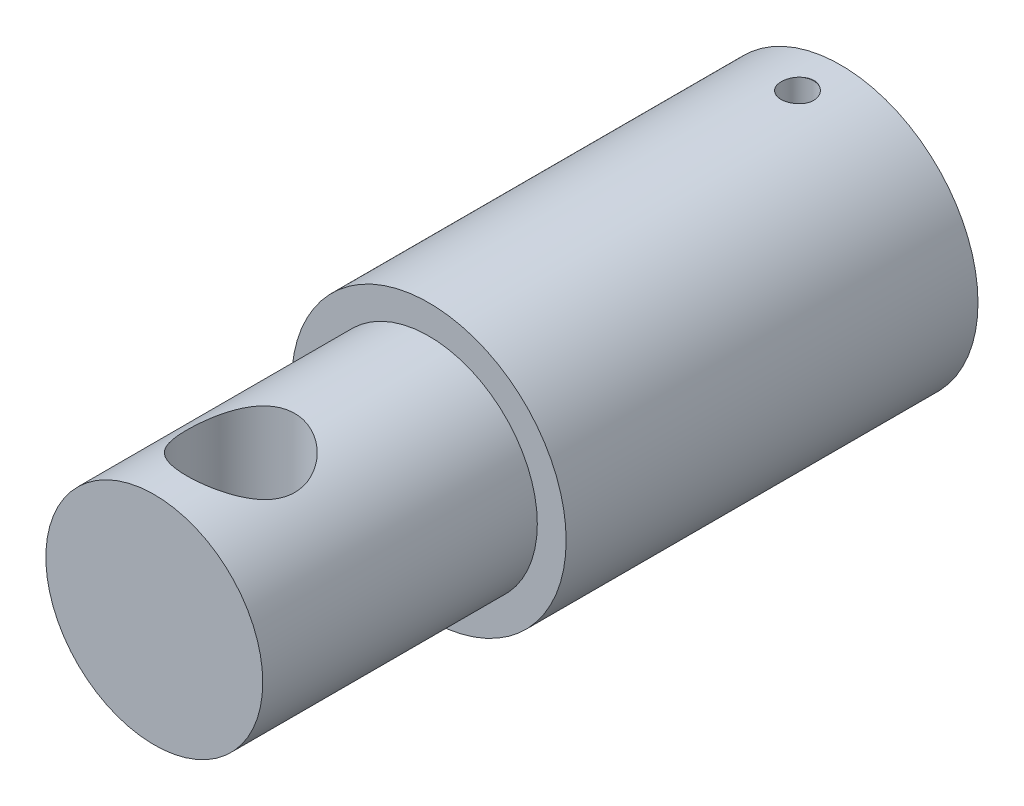
ISO-10303-21;
HEADER;
FILE_DESCRIPTION(('STEP AP214'),'2;1');
FILE_NAME('part.step','',(''),(''),'','','');
FILE_SCHEMA(('AUTOMOTIVE_DESIGN { 1 0 10303 214 1 1 1 1 }'));
ENDSEC;
DATA;
#1=APPLICATION_CONTEXT('core data for automotive mechanical design processes');
#2=APPLICATION_PROTOCOL_DEFINITION('international standard','automotive_design',2000,#1);
#3=PRODUCT_CONTEXT('',#1,'mechanical');
#4=PRODUCT('Part','Part','',(#3));
#5=PRODUCT_RELATED_PRODUCT_CATEGORY('part','',(#4));
#6=PRODUCT_DEFINITION_FORMATION('','',#4);
#7=PRODUCT_DEFINITION_CONTEXT('part definition',#1,'design');
#8=PRODUCT_DEFINITION('design','',#6,#7);
#9=PRODUCT_DEFINITION_SHAPE('','',#8);
#10=(LENGTH_UNIT() NAMED_UNIT(*) SI_UNIT(.MILLI.,.METRE.));
#11=(NAMED_UNIT(*) PLANE_ANGLE_UNIT() SI_UNIT($,.RADIAN.));
#12=(NAMED_UNIT(*) SI_UNIT($,.STERADIAN.) SOLID_ANGLE_UNIT());
#13=UNCERTAINTY_MEASURE_WITH_UNIT(LENGTH_MEASURE(1.E-05),#10,'distance_accuracy_value','');
#14=(GEOMETRIC_REPRESENTATION_CONTEXT(3) GLOBAL_UNCERTAINTY_ASSIGNED_CONTEXT((#13)) GLOBAL_UNIT_ASSIGNED_CONTEXT((#10,
#11,#12)) REPRESENTATION_CONTEXT('',''));
#15=CARTESIAN_POINT('',(0.,0.,0.));
#16=DIRECTION('',(0.,0.,1.));
#17=DIRECTION('',(1.,0.,0.));
#18=AXIS2_PLACEMENT_3D('',#15,#16,#17);
#19=CARTESIAN_POINT('',(0.,0.,38.1));
#20=DIRECTION('',(0.,0.,-1.));
#21=DIRECTION('',(-1.,0.,0.));
#22=AXIS2_PLACEMENT_3D('',#19,#20,#21);
#23=CYLINDRICAL_SURFACE('',#22,12.7);
#24=CARTESIAN_POINT('',(0.796476616103138,12.675,2.72892761811106));
#25=CARTESIAN_POINT('',(0.83228326903176,12.6727504600005,2.75136520389631));
#26=CARTESIAN_POINT('',(0.867120049985733,12.6704084743594,2.77530248675138));
#27=CARTESIAN_POINT('',(0.934645159015516,12.6656062503982,2.82602243491229));
#28=CARTESIAN_POINT('',(0.96733360011083,12.6631460183107,2.85280495034235));
#29=CARTESIAN_POINT('',(1.06178077488259,12.6556944774986,2.93711447745145));
#30=CARTESIAN_POINT('',(1.12002264056247,12.6506256612281,2.99866708112203));
#31=CARTESIAN_POINT('',(1.22534261391677,12.6408602942846,3.13070151915007));
#32=CARTESIAN_POINT('',(1.2724155167279,12.6361639178487,3.20118749317832));
#33=CARTESIAN_POINT('',(1.35405442168214,12.6276769552268,3.34910368580835));
#34=CARTESIAN_POINT('',(1.38862383717649,12.6238861219309,3.42653200199308));
#35=CARTESIAN_POINT('',(1.44419509437218,12.6176498233528,3.58597778134985));
#36=CARTESIAN_POINT('',(1.46522576315119,12.6152015012181,3.66798508720136));
#37=CARTESIAN_POINT('',(1.49321899540092,12.6119189174168,3.83441606786694));
#38=CARTESIAN_POINT('',(1.50017909478827,12.6110849384602,3.91884016329209));
#39=CARTESIAN_POINT('',(1.49981500112052,12.6111281966319,4.08713402059207));
#40=CARTESIAN_POINT('',(1.49257866963736,12.61199490821,4.17100398903161));
#41=CARTESIAN_POINT('',(1.46421589421185,12.6153189779794,4.33630844653025));
#42=CARTESIAN_POINT('',(1.44309242239105,12.6177759958122,4.41774345282118));
#43=CARTESIAN_POINT('',(1.38758019560208,12.624000735098,4.57588249832213));
#44=CARTESIAN_POINT('',(1.3531948152323,12.6277681230929,4.65258773530518));
#45=CARTESIAN_POINT('',(1.2721442449831,12.6361902923363,4.79916803692011));
#46=CARTESIAN_POINT('',(1.22547557817368,12.6408453247401,4.86904115994833));
#47=CARTESIAN_POINT('',(1.12059361607007,12.6505753414022,5.00070744635629));
#48=CARTESIAN_POINT('',(1.06226804111814,12.6556541058223,5.06241148065851));
#49=CARTESIAN_POINT('',(0.967662878393486,12.6631209977478,5.14692055840801));
#50=CARTESIAN_POINT('',(0.93491474545614,12.665586525613,5.17376601245782));
#51=CARTESIAN_POINT('',(0.867261318548442,12.6703989779319,5.22460039702882));
#52=CARTESIAN_POINT('',(0.832355929660025,12.6727458971586,5.2485892017229));
#53=CARTESIAN_POINT('',(0.79647661610314,12.675,5.271072381889));
#54=B_SPLINE_CURVE_WITH_KNOTS('',3,(#24,#25,#26,#27,#28,#29,#30,#31,#32,#33,#34,#35,#36,#37,#38,
#39,#40,#41,#42,#43,#44,#45,#46,#47,#48,#49,#50,#51,#52,#53),.UNSPECIFIED.,.F.,.F.,(4,2,2,2,2,2,
2,2,2,2,2,2,2,2,4),(0.,0.126868740513763,0.253730801386699,0.507100136603615,0.76058731391335,
1.01400523894437,1.26688177901155,1.51980259979673,1.77116303359225,2.02246968880958,
2.27371243918891,2.52502638343692,2.77888902049528,2.90600911171719,3.03313480014016),.UNSPECIFIED.);
#55=CARTESIAN_POINT('',(0.796476616103138,12.675,2.72892761811106));
#56=VERTEX_POINT('',#55);
#57=CARTESIAN_POINT('',(0.796476616103138,12.675,5.271072381889));
#58=VERTEX_POINT('',#57);
#59=EDGE_CURVE('E67',#56,#58,#54,.T.);
#60=ORIENTED_EDGE('',*,*,#59,.T.);
#61=CARTESIAN_POINT('',(0.838339257102967,12.6723,5.24060250684904));
#62=CARTESIAN_POINT('',(0.779235874734315,12.6762227277297,5.28533335361582));
#63=CARTESIAN_POINT('',(0.71660566360087,12.6799389014039,5.32545955951411));
#64=CARTESIAN_POINT('',(0.585728130001287,12.6866518515528,5.39552305013213));
#65=CARTESIAN_POINT('',(0.51747220460824,12.6896474977152,5.42544435646564));
#66=CARTESIAN_POINT('',(0.371858119090404,12.6947792090597,5.47573938066303));
#67=CARTESIAN_POINT('',(0.294199077883257,12.6968367953454,5.49525918816023));
#68=CARTESIAN_POINT('',(0.136723322408732,12.6995075462745,5.52045295750477));
#69=CARTESIAN_POINT('',(0.0569090205334546,12.7001222632439,5.5261417997757));
#70=CARTESIAN_POINT('',(-0.0994117426896097,12.6998423506763,5.52352815223721));
#71=CARTESIAN_POINT('',(-0.175927691053508,12.699004692173,5.51575378611459));
#72=CARTESIAN_POINT('',(-0.326619288710709,12.6960232965198,5.48751809439153));
#73=CARTESIAN_POINT('',(-0.400793071953805,12.6938785442869,5.46704690828037));
#74=CARTESIAN_POINT('',(-0.538254247920023,12.6887578886898,5.41654826333883));
#75=CARTESIAN_POINT('',(-0.601922453606824,12.685873229846,5.38753655007323));
#76=CARTESIAN_POINT('',(-0.724200970540768,12.679484967344,5.32055902608218));
#77=CARTESIAN_POINT('',(-0.782819100470136,12.6759823470289,5.28260740946126));
#78=CARTESIAN_POINT('',(-0.838339257102968,12.6723,5.24060250684904));
#79=B_SPLINE_CURVE_WITH_KNOTS('',3,(#61,#62,#63,#64,#65,#66,#67,#68,#69,#70,#71,#72,#73,#74,#75,
#76,#77,#78),.UNSPECIFIED.,.F.,.F.,(4,2,2,2,2,2,2,2,4),(0.,0.222490547030078,0.44532787770079,
0.684392057655266,0.923198919807684,1.15284889870033,1.38267745037067,1.59199756678331,
1.80098755430021),.UNSPECIFIED.);
#80=CARTESIAN_POINT('',(-0.796476616103138,12.675,5.271072381889));
#81=VERTEX_POINT('',#80);
#82=EDGE_CURVE('E11',#58,#81,#79,.T.);
#83=ORIENTED_EDGE('',*,*,#82,.T.);
#84=CARTESIAN_POINT('',(-0.796476616103138,12.675,5.271072381889));
#85=CARTESIAN_POINT('',(-0.83228326903176,12.6727504600005,5.24863479610375));
#86=CARTESIAN_POINT('',(-0.867120049985733,12.6704084743594,5.22469751324868));
#87=CARTESIAN_POINT('',(-0.934645159015516,12.6656062503982,5.17397756508777));
#88=CARTESIAN_POINT('',(-0.967333600110831,12.6631460183107,5.14719504965771));
#89=CARTESIAN_POINT('',(-1.06178077488259,12.6556944774986,5.06288552254861));
#90=CARTESIAN_POINT('',(-1.12002264056247,12.6506256612281,5.00133291887804));
#91=CARTESIAN_POINT('',(-1.22534261391677,12.6408602942846,4.86929848084999));
#92=CARTESIAN_POINT('',(-1.2724155167279,12.6361639178487,4.79881250682174));
#93=CARTESIAN_POINT('',(-1.35405442168214,12.6276769552268,4.65089631419171));
#94=CARTESIAN_POINT('',(-1.38862383717649,12.6238861219309,4.57346799800698));
#95=CARTESIAN_POINT('',(-1.44419509437218,12.6176498233528,4.41402221865022));
#96=CARTESIAN_POINT('',(-1.46522576315119,12.6152015012181,4.3320149127987));
#97=CARTESIAN_POINT('',(-1.49321899540092,12.6119189174168,4.16558393213312));
#98=CARTESIAN_POINT('',(-1.50017909478827,12.6110849384602,4.08115983670797));
#99=CARTESIAN_POINT('',(-1.49981500112052,12.6111281966319,3.91286597940799));
#100=CARTESIAN_POINT('',(-1.49257866963736,12.61199490821,3.82899601096845));
#101=CARTESIAN_POINT('',(-1.46421589421185,12.6153189779794,3.66369155346981));
#102=CARTESIAN_POINT('',(-1.44309242239105,12.6177759958122,3.58225654717888));
#103=CARTESIAN_POINT('',(-1.38758019560208,12.624000735098,3.42411750167793));
#104=CARTESIAN_POINT('',(-1.3531948152323,12.6277681230929,3.34741226469488));
#105=CARTESIAN_POINT('',(-1.2721442449831,12.6361902923363,3.20083196307995));
#106=CARTESIAN_POINT('',(-1.22547557817368,12.6408453247401,3.13095884005173));
#107=CARTESIAN_POINT('',(-1.12059361607007,12.6505753414022,2.99929255364377));
#108=CARTESIAN_POINT('',(-1.06226804111814,12.6556541058223,2.93758851934155));
#109=CARTESIAN_POINT('',(-0.967662878393486,12.6631209977478,2.85307944159205));
#110=CARTESIAN_POINT('',(-0.93491474545614,12.665586525613,2.82623398754224));
#111=CARTESIAN_POINT('',(-0.867261318548442,12.6703989779319,2.77539960297124));
#112=CARTESIAN_POINT('',(-0.832355929660025,12.6727458971586,2.75141079827715));
#113=CARTESIAN_POINT('',(-0.79647661610314,12.675,2.72892761811106));
#114=B_SPLINE_CURVE_WITH_KNOTS('',3,(#84,#85,#86,#87,#88,#89,#90,#91,#92,#93,#94,#95,#96,#97,
#98,#99,#100,#101,#102,#103,#104,#105,#106,#107,#108,#109,#110,#111,#112,#113),.UNSPECIFIED.,
.F.,.F.,(4,2,2,2,2,2,2,2,2,2,2,2,2,2,4),(0.,0.126868740513764,0.253730801386699,
0.507100136603615,0.76058731391335,1.01400523894437,1.26688177901155,1.51980259979674,
1.77116303359225,2.02246968880959,2.27371243918891,2.52502638343693,2.77888902049528,
2.90600911171719,3.03313480014017),.UNSPECIFIED.);
#115=CARTESIAN_POINT('',(-0.796476616103138,12.675,2.72892761811106));
#116=VERTEX_POINT('',#115);
#117=EDGE_CURVE('E60',#81,#116,#114,.T.);
#118=ORIENTED_EDGE('',*,*,#117,.T.);
#119=CARTESIAN_POINT('',(-0.83833925710296,12.6723,2.75939749315101));
#120=CARTESIAN_POINT('',(-0.779235874734307,12.6762227277297,2.71466664638423));
#121=CARTESIAN_POINT('',(-0.716605663600862,12.6799389014039,2.67454044048595));
#122=CARTESIAN_POINT('',(-0.585728130001278,12.6866518515528,2.60447694986792));
#123=CARTESIAN_POINT('',(-0.517472204608232,12.6896474977152,2.57455564353441));
#124=CARTESIAN_POINT('',(-0.371858119090395,12.6947792090597,2.52426061933703));
#125=CARTESIAN_POINT('',(-0.294199077883248,12.6968367953454,2.50474081183983));
#126=CARTESIAN_POINT('',(-0.136723322408723,12.6995075462745,2.47954704249529));
#127=CARTESIAN_POINT('',(-0.0569090205334451,12.7001222632439,2.47385820022436));
#128=CARTESIAN_POINT('',(0.0994117426896195,12.6998423506763,2.47647184776285));
#129=CARTESIAN_POINT('',(0.175927691053518,12.699004692173,2.48424621388547));
#130=CARTESIAN_POINT('',(0.326619288710719,12.6960232965198,2.51248190560853));
#131=CARTESIAN_POINT('',(0.400793071953815,12.6938785442869,2.53295309171969));
#132=CARTESIAN_POINT('',(0.538254247920029,12.6887578886898,2.58345173666123));
#133=CARTESIAN_POINT('',(0.601922453606827,12.685873229846,2.61246344992683));
#134=CARTESIAN_POINT('',(0.724200970540765,12.679484967344,2.67944097391787));
#135=CARTESIAN_POINT('',(0.78281910047013,12.6759823470289,2.71739259053879));
#136=CARTESIAN_POINT('',(0.83833925710296,12.6723,2.75939749315101));
#137=B_SPLINE_CURVE_WITH_KNOTS('',3,(#119,#120,#121,#122,#123,#124,#125,#126,#127,#128,#129,
#130,#131,#132,#133,#134,#135,#136),.UNSPECIFIED.,.F.,.F.,(4,2,2,2,2,2,2,2,4),(0.,
0.222490547030077,0.445327877700791,0.684392057655266,0.923198919807686,1.15284889870033,
1.38267745037067,1.5919975667833,1.80098755430019),.UNSPECIFIED.);
#138=EDGE_CURVE('E49',#116,#56,#137,.T.);
#139=ORIENTED_EDGE('',*,*,#138,.T.);
#140=EDGE_LOOP('',(#60,#83,#118,#139));
#141=FACE_BOUND('',#140,.T.);
#142=CARTESIAN_POINT('',(0.,0.,38.1));
#143=DIRECTION('',(0.,0.,1.));
#144=DIRECTION('',(1.,0.,0.));
#145=AXIS2_PLACEMENT_3D('',#142,#143,#144);
#146=CIRCLE('',#145,12.7);
#147=CARTESIAN_POINT('',(12.7,0.,38.1));
#148=VERTEX_POINT('',#147);
#149=EDGE_CURVE('E82',#148,#148,#146,.T.);
#150=ORIENTED_EDGE('',*,*,#149,.F.);
#151=EDGE_LOOP('',(#150));
#152=FACE_BOUND('',#151,.T.);
#153=CARTESIAN_POINT('',(0.,0.,0.));
#154=DIRECTION('',(0.,0.,1.));
#155=DIRECTION('',(1.,0.,0.));
#156=AXIS2_PLACEMENT_3D('',#153,#154,#155);
#157=CIRCLE('',#156,12.7);
#158=CARTESIAN_POINT('',(12.7,0.,0.));
#159=VERTEX_POINT('',#158);
#160=EDGE_CURVE('E89',#159,#159,#157,.T.);
#161=ORIENTED_EDGE('',*,*,#160,.T.);
#162=EDGE_LOOP('',(#161));
#163=FACE_BOUND('',#162,.T.);
#164=ADVANCED_FACE('F36',(#141,#152,#163),#23,.T.);
#165=CARTESIAN_POINT('',(0.,0.,38.1));
#166=DIRECTION('',(0.,0.,1.));
#167=DIRECTION('',(1.,0.,0.));
#168=AXIS2_PLACEMENT_3D('',#165,#166,#167);
#169=PLANE('',#168);
#170=CARTESIAN_POINT('',(0.,0.,38.1));
#171=DIRECTION('',(0.,0.,1.));
#172=DIRECTION('',(1.,0.,0.));
#173=AXIS2_PLACEMENT_3D('',#170,#171,#172);
#174=CIRCLE('',#173,10.033);
#175=CARTESIAN_POINT('',(10.033,0.,38.1));
#176=VERTEX_POINT('',#175);
#177=EDGE_CURVE('E80',#176,#176,#174,.T.);
#178=ORIENTED_EDGE('',*,*,#177,.F.);
#179=EDGE_LOOP('',(#178));
#180=FACE_BOUND('',#179,.T.);
#181=ORIENTED_EDGE('',*,*,#149,.T.);
#182=EDGE_LOOP('',(#181));
#183=FACE_BOUND('',#182,.T.);
#184=ADVANCED_FACE('F141',(#180,#183),#169,.T.);
#185=CARTESIAN_POINT('',(0.,0.,0.));
#186=DIRECTION('',(0.,0.,1.));
#187=DIRECTION('',(1.,0.,0.));
#188=AXIS2_PLACEMENT_3D('',#185,#186,#187);
#189=PLANE('',#188);
#190=CARTESIAN_POINT('',(0.,0.,0.));
#191=DIRECTION('',(0.,0.,-1.));
#192=DIRECTION('',(-1.,0.,0.));
#193=AXIS2_PLACEMENT_3D('',#190,#191,#192);
#194=CIRCLE('',#193,3.);
#195=CARTESIAN_POINT('',(-3.,0.,0.));
#196=VERTEX_POINT('',#195);
#197=EDGE_CURVE('E123',#196,#196,#194,.T.);
#198=ORIENTED_EDGE('',*,*,#197,.F.);
#199=EDGE_LOOP('',(#198));
#200=FACE_BOUND('',#199,.T.);
#201=ORIENTED_EDGE('',*,*,#160,.F.);
#202=EDGE_LOOP('',(#201));
#203=FACE_BOUND('',#202,.T.);
#204=ADVANCED_FACE('F138',(#200,#203),#189,.F.);
#205=CARTESIAN_POINT('',(0.,0.,63.5));
#206=DIRECTION('',(0.,0.,-1.));
#207=DIRECTION('',(-1.,0.,0.));
#208=AXIS2_PLACEMENT_3D('',#205,#206,#207);
#209=CYLINDRICAL_SURFACE('',#208,10.033);
#210=CARTESIAN_POINT('',(0.,10.033,60.5));
#211=CARTESIAN_POINT('',(-0.131540864730195,10.0329995722647,60.4999995330943));
#212=CARTESIAN_POINT('',(-0.263091696220209,10.0304070045411,60.4948030878062));
#213=CARTESIAN_POINT('',(-0.525225098454785,10.0201020323533,60.4740763194969));
#214=CARTESIAN_POINT('',(-0.655807218306546,10.0123873785436,60.45854145639));
#215=CARTESIAN_POINT('',(-0.915154955050193,9.99202298337232,60.4172915662735));
#216=CARTESIAN_POINT('',(-1.0439176769707,9.97936613259274,60.3915618730721));
#217=CARTESIAN_POINT('',(-1.29856322748691,9.9494356181176,60.3302066500944));
#218=CARTESIAN_POINT('',(-1.42444485592179,9.9321600671134,60.2945770747611));
#219=CARTESIAN_POINT('',(-1.67191505508108,9.89350288890859,60.213974637149));
#220=CARTESIAN_POINT('',(-1.79351986414459,9.87213937759451,60.169042928074));
#221=CARTESIAN_POINT('',(-2.03230766887236,9.825764056782,60.0701693599418));
#222=CARTESIAN_POINT('',(-2.14948898015281,9.8007508748499,60.0162241102918));
#223=CARTESIAN_POINT('',(-2.49329350202596,9.72109789530213,59.8415956220922));
#224=CARTESIAN_POINT('',(-2.71245118691574,9.66179996625116,59.7080294922662));
#225=CARTESIAN_POINT('',(-3.13885367064866,9.53212540783466,59.401377247378));
#226=CARTESIAN_POINT('',(-3.34458646361368,9.46129667565411,59.2263957025608));
#227=CARTESIAN_POINT('',(-3.72518869528113,9.31801734965284,58.8459645353375));
#228=CARTESIAN_POINT('',(-3.90003478107372,9.24556557491788,58.6404920734136));
#229=CARTESIAN_POINT('',(-4.22741994711618,9.10079694381141,58.1857317418323));
#230=CARTESIAN_POINT('',(-4.37720913768655,9.02891903097577,57.9342894248932));
#231=CARTESIAN_POINT('',(-4.56803395431131,8.93304159627392,57.5382870465914));
#232=CARTESIAN_POINT('',(-4.62601295296677,8.90306423299332,57.4030974804431));
#233=CARTESIAN_POINT('',(-4.73008911303649,8.84820924629343,57.1272501194843));
#234=CARTESIAN_POINT('',(-4.77619328891637,8.82332861401796,56.9865956095957));
#235=CARTESIAN_POINT('',(-4.85355758968325,8.780996446313,56.7093223887059));
#236=CARTESIAN_POINT('',(-4.88553443343517,8.76319253072689,56.5729570699114));
#237=CARTESIAN_POINT('',(-4.93798952530083,8.73374243064269,56.2974378204199));
#238=CARTESIAN_POINT('',(-4.9584738549028,8.72209298957503,56.1582854050238));
#239=CARTESIAN_POINT('',(-4.9876415560458,8.70544683191919,55.8784345368941));
#240=CARTESIAN_POINT('',(-4.99633192530836,8.70044617044018,55.7377370509041));
#241=CARTESIAN_POINT('',(-5.00179041304937,8.69730959634689,55.4560404198524));
#242=CARTESIAN_POINT('',(-4.99855965575494,8.69917303641045,55.3150413044892));
#243=CARTESIAN_POINT('',(-4.98132666139066,8.70904999094334,55.0508075907944));
#244=CARTESIAN_POINT('',(-4.96865156315122,8.71630549721633,54.9274551315232));
#245=CARTESIAN_POINT('',(-4.93424953685685,8.73582634418467,54.6823830774975));
#246=CARTESIAN_POINT('',(-4.91251976315517,8.74809325981063,54.5606640084987));
#247=CARTESIAN_POINT('',(-4.86025821990202,8.77723602366804,54.3197109079259));
#248=CARTESIAN_POINT('',(-4.82972756350737,8.79411128901013,54.2004765641218));
#249=CARTESIAN_POINT('',(-4.76018186740574,8.83194876720125,53.9651562890291));
#250=CARTESIAN_POINT('',(-4.7211634952337,8.85291258497108,53.8490716145621));
#251=CARTESIAN_POINT('',(-4.58991232170742,8.92209378712494,53.5012639636328));
#252=CARTESIAN_POINT('',(-4.48466729113753,8.97590525992497,53.2754116941641));
#253=CARTESIAN_POINT('',(-4.2432217843293,9.09252876847846,52.8436096732189));
#254=CARTESIAN_POINT('',(-4.10700741031805,9.15534484043653,52.6376689165317));
#255=CARTESIAN_POINT('',(-3.78749729922859,9.29246187022492,52.224110751675));
#256=CARTESIAN_POINT('',(-3.60043371007258,9.3672132870509,52.0195442923545));
#257=CARTESIAN_POINT('',(-3.19419244107262,9.5133961149528,51.6433544138119));
#258=CARTESIAN_POINT('',(-2.97499969147764,9.584825947261,51.4717465411123));
#259=CARTESIAN_POINT('',(-2.62028945090877,9.68562402899397,51.2390878656359));
#260=CARTESIAN_POINT('',(-2.49466097955547,9.71881796501704,51.164317218799));
#261=CARTESIAN_POINT('',(-2.23661541825869,9.7814225380882,51.0257438671112));
#262=CARTESIAN_POINT('',(-2.10420121904226,9.8108347677148,50.9619365414776));
#263=CARTESIAN_POINT('',(-1.83351172413531,9.86500759821179,50.8459789949352));
#264=CARTESIAN_POINT('',(-1.69523879407558,9.88977005503232,50.7938241213821));
#265=CARTESIAN_POINT('',(-1.41383468641849,9.93390311862201,50.7017736304453));
#266=CARTESIAN_POINT('',(-1.27070406562787,9.95327434102854,50.6618766132548));
#267=CARTESIAN_POINT('',(-0.992765288481646,9.98465950326604,50.5976482319078));
#268=CARTESIAN_POINT('',(-0.858244031533172,9.99714838838779,50.5723046501154));
#269=CARTESIAN_POINT('',(-0.587193765444006,10.0167234403292,50.5327112884579));
#270=CARTESIAN_POINT('',(-0.450664933287122,10.0238100805237,50.5184605365747));
#271=CARTESIAN_POINT('',(-0.176774275648409,10.0323778933791,50.5012428725512));
#272=CARTESIAN_POINT('',(-0.0394127859880248,10.0338611925189,50.498271679794));
#273=CARTESIAN_POINT('',(0.23503048067839,10.0311852743541,50.5036418173939));
#274=CARTESIAN_POINT('',(0.37211226964314,10.0270263035739,50.5119826535009));
#275=CARTESIAN_POINT('',(0.634310169970533,10.0137216816871,50.5387849557536));
#276=CARTESIAN_POINT('',(0.759533180244535,10.0049857070186,50.5564155655778));
#277=CARTESIAN_POINT('',(1.00794131318881,9.98302044461568,50.6010220689851));
#278=CARTESIAN_POINT('',(1.13112577700337,9.96978973282393,50.6280009244058));
#279=CARTESIAN_POINT('',(1.37458430164348,9.93914728078672,50.6910168419642));
#280=CARTESIAN_POINT('',(1.49485923954788,9.92173681826401,50.7270511360702));
#281=CARTESIAN_POINT('',(1.73183826220454,9.88313074649505,50.8078327394444));
#282=CARTESIAN_POINT('',(1.84854095935088,9.86193368769632,50.8525833860271));
#283=CARTESIAN_POINT('',(2.19878769267123,9.79203596530955,51.0021264201482));
#284=CARTESIAN_POINT('',(2.42565260708697,9.73791900500297,51.1204399814796));
#285=CARTESIAN_POINT('',(2.8569447254172,9.62024520509635,51.3887316990956));
#286=CARTESIAN_POINT('',(3.06136228701047,9.55668433621089,51.5387233825598));
#287=CARTESIAN_POINT('',(3.46327268095114,9.41892836756956,51.8830350124518));
#288=CARTESIAN_POINT('',(3.65813744288069,9.344301021795,52.0802542120161));
#289=CARTESIAN_POINT('',(4.0132435895597,9.1973890075663,52.50492599364));
#290=CARTESIAN_POINT('',(4.17346141186284,9.12510596162772,52.7323989817457));
#291=CARTESIAN_POINT('',(4.38793196713052,9.02296170305543,53.0984614596365));
#292=CARTESIAN_POINT('',(4.45634292210781,8.98927376161504,53.2278754215238));
#293=CARTESIAN_POINT('',(4.58186024359912,8.92594991942466,53.4930027574964));
#294=CARTESIAN_POINT('',(4.63897172918507,8.89631218567369,53.6287132444667));
#295=CARTESIAN_POINT('',(4.741219346787,8.8422438820863,53.9054513028168));
#296=CARTESIAN_POINT('',(4.78636519243357,8.81780909172168,54.0464744545213));
#297=CARTESIAN_POINT('',(4.86413033543301,8.77515234376633,54.3328508097709));
#298=CARTESIAN_POINT('',(4.89675155677885,8.75692943197482,54.4782033445503));
#299=CARTESIAN_POINT('',(4.9464554595233,8.72894030191192,54.7578582319066));
#300=CARTESIAN_POINT('',(4.96472705957398,8.71853132949257,54.8918857187632));
#301=CARTESIAN_POINT('',(4.99035023734126,8.70389077634884,55.161311232261));
#302=CARTESIAN_POINT('',(4.99770294306826,8.69965855751647,55.2967091158739));
#303=CARTESIAN_POINT('',(5.00137718008069,8.69754675514822,55.5676564770319));
#304=CARTESIAN_POINT('',(4.99770250866788,8.69966498482109,55.7032058863296));
#305=CARTESIAN_POINT('',(4.97938752293832,8.71016070385181,55.9733105592988));
#306=CARTESIAN_POINT('',(4.96474764653285,8.71853794324706,56.1078658624547));
#307=CARTESIAN_POINT('',(4.92660966989265,8.7401393291248,56.3622405612726));
#308=CARTESIAN_POINT('',(4.90407859130426,8.75283108464783,56.4822516398906));
#309=CARTESIAN_POINT('',(4.85045826430013,8.78265769470579,56.7197953041875));
#310=CARTESIAN_POINT('',(4.81936636650091,8.79979392461143,56.8373271104441));
#311=CARTESIAN_POINT('',(4.71369630667917,8.85712361598422,57.1851371558988));
#312=CARTESIAN_POINT('',(4.62669924843954,8.90325279528233,57.4107906414114));
#313=CARTESIAN_POINT('',(4.41561055864521,9.00989985556859,57.859678728259));
#314=CARTESIAN_POINT('',(4.28941862898353,9.07117647670349,58.081731240036));
#315=CARTESIAN_POINT('',(4.00581214149671,9.19993466752445,58.5029931465268));
#316=CARTESIAN_POINT('',(3.84838139936376,9.26741944379022,58.7021906156428));
#317=CARTESIAN_POINT('',(3.48458761178114,9.41070711263796,59.0969639551089));
#318=CARTESIAN_POINT('',(3.2746151021775,9.48653312397083,59.2892154560168));
#319=CARTESIAN_POINT('',(2.8230976193965,9.63053399844143,59.6365589165295));
#320=CARTESIAN_POINT('',(2.58153586601247,9.69870475908156,59.7916310014959));
#321=CARTESIAN_POINT('',(2.19914273910541,9.7899090785333,59.992748003288));
#322=CARTESIAN_POINT('',(2.06780120374332,9.81855569691538,60.0547124213021));
#323=CARTESIAN_POINT('',(1.79945764293371,9.87125550229536,60.1672347183668));
#324=CARTESIAN_POINT('',(1.66245843667665,9.89531094424818,60.2177981992093));
#325=CARTESIAN_POINT('',(1.38411447022361,9.93806369465875,60.3068221914098));
#326=CARTESIAN_POINT('',(1.24277997677353,9.95677272068872,60.3453091888659));
#327=CARTESIAN_POINT('',(0.956717056679334,9.98831611913557,60.4098029490308));
#328=CARTESIAN_POINT('',(0.811990769515456,10.0011540953463,60.435817368189));
#329=CARTESIAN_POINT('',(0.555993824335331,10.0181923827734,60.4702362848318));
#330=CARTESIAN_POINT('',(0.445172617429323,10.0237357197244,60.4813883058725));
#331=CARTESIAN_POINT('',(0.222903336943949,10.0311397603054,60.4962704635559));
#332=CARTESIAN_POINT('',(0.111455246169683,10.0330003624223,60.5000003956116));
#333=CARTESIAN_POINT('',(0.,10.033,60.5));
#334=B_SPLINE_CURVE_WITH_KNOTS('',3,(#210,#211,#212,#213,#214,#215,#216,#217,#218,#219,#220,
#221,#222,#223,#224,#225,#226,#227,#228,#229,#230,#231,#232,#233,#234,#235,#236,#237,#238,#239,
#240,#241,#242,#243,#244,#245,#246,#247,#248,#249,#250,#251,#252,#253,#254,#255,#256,#257,#258,
#259,#260,#261,#262,#263,#264,#265,#266,#267,#268,#269,#270,#271,#272,#273,#274,#275,#276,#277,
#278,#279,#280,#281,#282,#283,#284,#285,#286,#287,#288,#289,#290,#291,#292,#293,#294,#295,#296,
#297,#298,#299,#300,#301,#302,#303,#304,#305,#306,#307,#308,#309,#310,#311,#312,#313,#314,#315,
#316,#317,#318,#319,#320,#321,#322,#323,#324,#325,#326,#327,#328,#329,#330,#331,#332,#333),
.UNSPECIFIED.,.T.,.F.,(4,2,2,2,2,2,2,2,2,2,2,2,2,2,2,2,2,2,2,2,2,2,2,2,2,2,2,2,2,2,2,2,2,2,2,2,
2,2,2,2,2,2,2,2,2,2,2,2,2,2,2,2,2,2,2,2,2,2,2,2,2,4),(0.,0.394512576685641,0.789198516830045,
1.18445432222926,1.57987188587728,1.97357611341457,2.36742877412656,3.15426879793684,
3.98848920268418,4.82333767241394,5.72239463303882,6.17222776456732,6.62179456679807,
7.04476954217359,7.46752048046019,7.8900204777136,8.31248063193621,8.68468333033282,
9.05700309059222,9.42927577959974,9.80169489576495,10.5631316875647,11.3249108578326,
12.1825632765078,13.0406192604343,13.4898658923342,13.9389227103503,14.3877999051929,
14.8366258206733,15.2484435638674,15.6602252171425,16.0718505827658,16.4834579640589,
16.8632952579334,17.2432530071998,17.6230947534109,18.0030822202219,18.7841141396014,
19.5654802517133,20.4231908254023,21.2814828831084,21.7316036545675,22.1815200355886,
22.6310700508387,23.0805509799867,23.4869855545449,23.8933781381916,24.299630795712,
24.7058672298118,25.0737429172451,25.44173258225,26.1772280789085,26.9621606745554,
27.7475009974751,28.627407416241,29.5077831544967,29.951340135961,30.3946787007462,
30.8370380287146,31.2791254600521,31.6133887664545,31.94766128657),.UNSPECIFIED.);
#335=CARTESIAN_POINT('',(0.,10.033,60.5));
#336=VERTEX_POINT('',#335);
#337=EDGE_CURVE('E273',#336,#336,#334,.T.);
#338=ORIENTED_EDGE('',*,*,#337,.T.);
#339=EDGE_LOOP('',(#338));
#340=FACE_BOUND('',#339,.T.);
#341=CARTESIAN_POINT('',(0.,0.,63.5));
#342=DIRECTION('',(0.,0.,1.));
#343=DIRECTION('',(1.,0.,0.));
#344=AXIS2_PLACEMENT_3D('',#341,#342,#343);
#345=CIRCLE('',#344,10.033);
#346=CARTESIAN_POINT('',(10.033,0.,63.5));
#347=VERTEX_POINT('',#346);
#348=EDGE_CURVE('E127',#347,#347,#345,.T.);
#349=ORIENTED_EDGE('',*,*,#348,.F.);
#350=EDGE_LOOP('',(#349));
#351=FACE_BOUND('',#350,.T.);
#352=ORIENTED_EDGE('',*,*,#177,.T.);
#353=EDGE_LOOP('',(#352));
#354=FACE_BOUND('',#353,.T.);
#355=ADVANCED_FACE('F140',(#340,#351,#354),#209,.T.);
#356=CARTESIAN_POINT('',(0.,0.,63.5));
#357=DIRECTION('',(0.,0.,1.));
#358=DIRECTION('',(1.,0.,0.));
#359=AXIS2_PLACEMENT_3D('',#356,#357,#358);
#360=PLANE('',#359);
#361=ORIENTED_EDGE('',*,*,#348,.T.);
#362=EDGE_LOOP('',(#361));
#363=FACE_BOUND('',#362,.T.);
#364=ADVANCED_FACE('F147',(#363),#360,.T.);
#365=CARTESIAN_POINT('',(0.,0.,19.));
#366=DIRECTION('',(0.,0.,-1.));
#367=DIRECTION('',(-1.,0.,0.));
#368=AXIS2_PLACEMENT_3D('',#365,#366,#367);
#369=CYLINDRICAL_SURFACE('',#368,3.);
#370=CARTESIAN_POINT('',(0.,3.,5.50000000000004));
#371=CARTESIAN_POINT('',(0.0788579444268498,2.99999570107562,5.49999504652425));
#372=CARTESIAN_POINT('',(0.157809899546343,2.99685736529635,5.49374489031845));
#373=CARTESIAN_POINT('',(0.313380352903344,2.98461234055736,5.46902067948773));
#374=CARTESIAN_POINT('',(0.389994130070444,2.97549431743379,5.45052341050332));
#375=CARTESIAN_POINT('',(0.538400317320673,2.95224419105063,5.4022092870751));
#376=CARTESIAN_POINT('',(0.610210204408719,2.93813158766306,5.37243642362809));
#377=CARTESIAN_POINT('',(0.747708925209897,2.90618664773642,5.30264406795256));
#378=CARTESIAN_POINT('',(0.813398240985088,2.88835460450288,5.26262538362674));
#379=CARTESIAN_POINT('',(0.941261726642863,2.84934387387093,5.17072412577211));
#380=CARTESIAN_POINT('',(1.00298281668316,2.82802798691306,5.11827028114058));
#381=CARTESIAN_POINT('',(1.11716916730047,2.78489955370115,5.00421778112949));
#382=CARTESIAN_POINT('',(1.16962737466015,2.76308664313552,4.94261222234138));
#383=CARTESIAN_POINT('',(1.26787800067542,2.71948426796021,4.80627497571497));
#384=CARTESIAN_POINT('',(1.31283800332745,2.69782780455198,4.73089585248117));
#385=CARTESIAN_POINT('',(1.38925234033604,2.65928968158481,4.57244899602072));
#386=CARTESIAN_POINT('',(1.4207163224495,2.64240461410485,4.48938680691592));
#387=CARTESIAN_POINT('',(1.46719866328288,2.61686800556713,4.32300234186716));
#388=CARTESIAN_POINT('',(1.48308878562066,2.6077840737557,4.23999332189895));
#389=CARTESIAN_POINT('',(1.50064048996327,2.59772834922792,4.07203174333083));
#390=CARTESIAN_POINT('',(1.50231613255961,2.59674854014932,3.98708118869331));
#391=CARTESIAN_POINT('',(1.49203093075844,2.60266395385873,3.82857096352699));
#392=CARTESIAN_POINT('',(1.48167683930523,2.6086314549302,3.75486395316547));
#393=CARTESIAN_POINT('',(1.4504097735854,2.62614343100776,3.61041713594048));
#394=CARTESIAN_POINT('',(1.42949343584648,2.63768968247665,3.53967828204207));
#395=CARTESIAN_POINT('',(1.377314670579,2.66531214619112,3.40115630115155));
#396=CARTESIAN_POINT('',(1.34582260067399,2.68148760995998,3.33348040182136));
#397=CARTESIAN_POINT('',(1.273562531502,2.71655106422106,3.20404856111503));
#398=CARTESIAN_POINT('',(1.2327903657187,2.73544027170286,3.14229529659991));
#399=CARTESIAN_POINT('',(1.13709908236918,2.77669736854929,3.0182181208852));
#400=CARTESIAN_POINT('',(1.08104168755392,2.79920265355119,2.95681468963581));
#401=CARTESIAN_POINT('',(0.959333368112059,2.84321434950611,2.84389687211369));
#402=CARTESIAN_POINT('',(0.893677884861427,2.86472027938201,2.79238721194922));
#403=CARTESIAN_POINT('',(0.750774758747771,2.90552980924446,2.69847150845545));
#404=CARTESIAN_POINT('',(0.673130387399112,2.92468476243011,2.65659929133143));
#405=CARTESIAN_POINT('',(0.510699323233193,2.95736821681863,2.58685445643553));
#406=CARTESIAN_POINT('',(0.425918364397912,2.9709011841533,2.55897072247729));
#407=CARTESIAN_POINT('',(0.259149737491052,2.98986500612153,2.52028689442503));
#408=CARTESIAN_POINT('',(0.177512295822488,2.99587407451965,2.50826314637987));
#409=CARTESIAN_POINT('',(0.0131693999240265,3.00109520188655,2.49780290329831));
#410=CARTESIAN_POINT('',(-0.0695355298048641,3.00031048081978,2.49935997154084));
#411=CARTESIAN_POINT('',(-0.226849457978981,2.99236788380152,2.51531003262816));
#412=CARTESIAN_POINT('',(-0.301589112074896,2.98570868532252,2.52869879909503));
#413=CARTESIAN_POINT('',(-0.447610338452912,2.9673325697226,2.56635710784272));
#414=CARTESIAN_POINT('',(-0.518891528536631,2.95561509501618,2.59062784968028));
#415=CARTESIAN_POINT('',(-0.65833291267436,2.92776377120382,2.64999769964959));
#416=CARTESIAN_POINT('',(-0.726345595508705,2.91151322654446,2.68538657517447));
#417=CARTESIAN_POINT('',(-0.855692042548908,2.87615961476126,2.76566130346989));
#418=CARTESIAN_POINT('',(-0.917022944664888,2.85705533350407,2.81055120189314));
#419=CARTESIAN_POINT('',(-1.03765153393382,2.81562332004297,2.91364063799612));
#420=CARTESIAN_POINT('',(-1.09615811672854,2.79316327265249,2.97271430266776));
#421=CARTESIAN_POINT('',(-1.20278448167828,2.7489358741323,3.09988772691663));
#422=CARTESIAN_POINT('',(-1.25089707856781,2.72716901100071,3.16799367827192));
#423=CARTESIAN_POINT('',(-1.33756187171853,2.68576788309734,3.31546548125951));
#424=CARTESIAN_POINT('',(-1.37553824370037,2.66628794383591,3.39521689914176));
#425=CARTESIAN_POINT('',(-1.43712423890205,2.63361108441202,3.56126510136249));
#426=CARTESIAN_POINT('',(-1.46075237380052,2.62040607332625,3.64755328970038));
#427=CARTESIAN_POINT('',(-1.49079253120031,2.60342251538703,3.8153653343271));
#428=CARTESIAN_POINT('',(-1.49863949460818,2.59886075197597,3.8965513801529));
#429=CARTESIAN_POINT('',(-1.5010337315643,2.59748031962405,4.05917060074683));
#430=CARTESIAN_POINT('',(-1.49558676993486,2.60065829439585,4.14060365310683));
#431=CARTESIAN_POINT('',(-1.47288918838996,2.61356793076615,4.2932252523002));
#432=CARTESIAN_POINT('',(-1.45681247151455,2.62264641723988,4.36465070521715));
#433=CARTESIAN_POINT('',(-1.41476303733662,2.64556524281479,4.50371217913659));
#434=CARTESIAN_POINT('',(-1.38878713673988,2.65940711354503,4.57134697313809));
#435=CARTESIAN_POINT('',(-1.32572361795084,2.69142795546804,4.70593727647985));
#436=CARTESIAN_POINT('',(-1.28800670672355,2.70983583593881,4.77254185274358));
#437=CARTESIAN_POINT('',(-1.20322645745609,2.74852997452291,4.89891180427193));
#438=CARTESIAN_POINT('',(-1.15615825686234,2.76881720693416,4.95867359578171));
#439=CARTESIAN_POINT('',(-1.04730498999206,2.81193484737138,5.07721297353205));
#440=CARTESIAN_POINT('',(-0.98442663449589,2.83477474959942,5.13498865352548));
#441=CARTESIAN_POINT('',(-0.849232209349794,2.87816628389896,5.23939447515294));
#442=CARTESIAN_POINT('',(-0.776911084957794,2.89871667939293,5.2860186092049));
#443=CARTESIAN_POINT('',(-0.623897395174417,2.93547014349806,5.36685454406815));
#444=CARTESIAN_POINT('',(-0.543149255665094,2.95164144740899,5.40097625385474));
#445=CARTESIAN_POINT('',(-0.376113151707129,2.9775201194848,5.45471225163615));
#446=CARTESIAN_POINT('',(-0.289841699383649,2.98724585044602,5.47436777020861));
#447=CARTESIAN_POINT('',(-0.168902919736342,2.99543192870217,5.49084611662865));
#448=CARTESIAN_POINT('',(-0.135242819162347,2.99714048010376,5.49427396129955));
#449=CARTESIAN_POINT('',(-0.0677275977076373,2.99942545465223,5.49885199827117));
#450=CARTESIAN_POINT('',(-0.0338724714699428,3.00000184655071,5.50000212770535));
#451=CARTESIAN_POINT('',(0.,3.,5.50000000000004));
#452=B_SPLINE_CURVE_WITH_KNOTS('',3,(#370,#371,#372,#373,#374,#375,#376,#377,#378,#379,#380,
#381,#382,#383,#384,#385,#386,#387,#388,#389,#390,#391,#392,#393,#394,#395,#396,#397,#398,#399,
#400,#401,#402,#403,#404,#405,#406,#407,#408,#409,#410,#411,#412,#413,#414,#415,#416,#417,#418,
#419,#420,#421,#422,#423,#424,#425,#426,#427,#428,#429,#430,#431,#432,#433,#434,#435,#436,#437,
#438,#439,#440,#441,#442,#443,#444,#445,#446,#447,#448,#449,#450,#451),.UNSPECIFIED.,.T.,.F.,(4,
2,2,2,2,2,2,2,2,2,2,2,2,2,2,2,2,2,2,2,2,2,2,2,2,2,2,2,2,2,2,2,2,2,2,2,2,2,2,2,4),(0.,
0.236436386130438,0.473322224563796,0.709293233238447,0.94524564087235,1.19547263807713,
1.44588935648105,1.71572589646129,1.98536921847421,2.23887018210344,2.4921203599353,
2.71508568613981,2.93812205888517,3.16635360252731,3.39468781890332,3.65197412000817,
3.90938301898029,4.17874533321661,4.44789325368419,4.69474935707018,4.94148846767214,
5.16910359759182,5.39674382446397,5.63089284041848,5.86514176122508,6.12239415966628,
6.37982382923147,6.64972023242588,6.91926767918176,7.16293961254569,7.40650589797017,
7.62686895373283,7.84730293182526,8.0825468517043,8.31791341715446,8.58187864135757,
8.84598575071868,9.11196020495289,9.37717362931723,9.47872920200875,9.58028757766598),.UNSPECIFIED.);
#453=CARTESIAN_POINT('',(0.,3.,5.50000000000004));
#454=VERTEX_POINT('',#453);
#455=EDGE_CURVE('E74',#454,#454,#452,.T.);
#456=ORIENTED_EDGE('',*,*,#455,.T.);
#457=EDGE_LOOP('',(#456));
#458=FACE_BOUND('',#457,.T.);
#459=CARTESIAN_POINT('',(0.,0.,19.));
#460=DIRECTION('',(0.,0.,-1.));
#461=DIRECTION('',(-1.,0.,0.));
#462=AXIS2_PLACEMENT_3D('',#459,#460,#461);
#463=CIRCLE('',#462,3.);
#464=CARTESIAN_POINT('',(-3.,0.,19.));
#465=VERTEX_POINT('',#464);
#466=EDGE_CURVE('E124',#465,#465,#463,.T.);
#467=ORIENTED_EDGE('',*,*,#466,.F.);
#468=EDGE_LOOP('',(#467));
#469=FACE_BOUND('',#468,.T.);
#470=ORIENTED_EDGE('',*,*,#197,.T.);
#471=EDGE_LOOP('',(#470));
#472=FACE_BOUND('',#471,.T.);
#473=ADVANCED_FACE('F172',(#458,#469,#472),#369,.F.);
#474=CARTESIAN_POINT('',(0.,0.,19.));
#475=DIRECTION('',(0.,0.,-1.));
#476=DIRECTION('',(-1.,0.,0.));
#477=AXIS2_PLACEMENT_3D('',#474,#475,#476);
#478=PLANE('',#477);
#479=ORIENTED_EDGE('',*,*,#466,.T.);
#480=EDGE_LOOP('',(#479));
#481=FACE_BOUND('',#480,.T.);
#482=ADVANCED_FACE('F96',(#481),#478,.T.);
#483=CARTESIAN_POINT('',(0.,12.7,4.00000000000003));
#484=DIRECTION('',(0.,1.,0.));
#485=DIRECTION('',(0.,0.,1.));
#486=AXIS2_PLACEMENT_3D('',#483,#484,#485);
#487=CONICAL_SURFACE('',#486,1.525,0.78539816339737);
#488=CARTESIAN_POINT('',(0.,12.675,4.00000000000003));
#489=DIRECTION('',(0.,1.,0.));
#490=DIRECTION('',(0.,0.,1.));
#491=AXIS2_PLACEMENT_3D('',#488,#489,#490);
#492=CIRCLE('',#491,1.5);
#493=EDGE_CURVE('E71',#81,#58,#492,.T.);
#494=ORIENTED_EDGE('',*,*,#493,.F.);
#495=ORIENTED_EDGE('',*,*,#82,.F.);
#496=EDGE_LOOP('',(#494,#495));
#497=FACE_BOUND('',#496,.T.);
#498=ADVANCED_FACE('F91',(#497),#487,.F.);
#499=EDGE_CURVE('E70',#56,#116,#492,.T.);
#500=ORIENTED_EDGE('',*,*,#499,.F.);
#501=ORIENTED_EDGE('',*,*,#138,.F.);
#502=EDGE_LOOP('',(#500,#501));
#503=FACE_BOUND('',#502,.T.);
#504=ADVANCED_FACE('F77',(#503),#487,.F.);
#505=CARTESIAN_POINT('',(0.,12.7,4.00000000000003));
#506=DIRECTION('',(0.,1.,0.));
#507=DIRECTION('',(0.,0.,1.));
#508=AXIS2_PLACEMENT_3D('',#505,#506,#507);
#509=CYLINDRICAL_SURFACE('',#508,1.5);
#510=ORIENTED_EDGE('',*,*,#455,.F.);
#511=EDGE_LOOP('',(#510));
#512=FACE_BOUND('',#511,.T.);
#513=ORIENTED_EDGE('',*,*,#493,.T.);
#514=ORIENTED_EDGE('',*,*,#59,.F.);
#515=ORIENTED_EDGE('',*,*,#499,.T.);
#516=ORIENTED_EDGE('',*,*,#117,.F.);
#517=EDGE_LOOP('',(#513,#514,#515,#516));
#518=FACE_BOUND('',#517,.T.);
#519=ADVANCED_FACE('F69',(#512,#518),#509,.F.);
#520=CARTESIAN_POINT('',(0.,0.,55.5));
#521=DIRECTION('',(0.,-1.,0.));
#522=DIRECTION('',(0.,0.,-1.));
#523=AXIS2_PLACEMENT_3D('',#520,#521,#522);
#524=PLANE('',#523);
#525=CARTESIAN_POINT('',(0.,0.,55.5));
#526=DIRECTION('',(0.,1.,0.));
#527=DIRECTION('',(0.,0.,1.));
#528=AXIS2_PLACEMENT_3D('',#525,#526,#527);
#529=CIRCLE('',#528,5.);
#530=CARTESIAN_POINT('',(0.,0.,60.5));
#531=VERTEX_POINT('',#530);
#532=EDGE_CURVE('E279',#531,#531,#529,.T.);
#533=ORIENTED_EDGE('',*,*,#532,.T.);
#534=EDGE_LOOP('',(#533));
#535=FACE_BOUND('',#534,.T.);
#536=ADVANCED_FACE('F103',(#535),#524,.F.);
#537=CARTESIAN_POINT('',(0.,12.7000000000001,55.5));
#538=DIRECTION('',(0.,1.,0.));
#539=DIRECTION('',(0.,0.,1.));
#540=AXIS2_PLACEMENT_3D('',#537,#538,#539);
#541=CYLINDRICAL_SURFACE('',#540,5.);
#542=ORIENTED_EDGE('',*,*,#337,.F.);
#543=EDGE_LOOP('',(#542));
#544=FACE_BOUND('',#543,.T.);
#545=ORIENTED_EDGE('',*,*,#532,.F.);
#546=EDGE_LOOP('',(#545));
#547=FACE_BOUND('',#546,.T.);
#548=ADVANCED_FACE('F213',(#544,#547),#541,.F.);
#549=CLOSED_SHELL('',(#164,#184,#204,#355,#364,#473,#482,#498,#504,#519,#536,#548));
#550=MANIFOLD_SOLID_BREP('B2',#549);
#551=ADVANCED_BREP_SHAPE_REPRESENTATION('',(#18,#550),#14);
#552=SHAPE_DEFINITION_REPRESENTATION(#9,#551);
ENDSEC;
END-ISO-10303-21;
